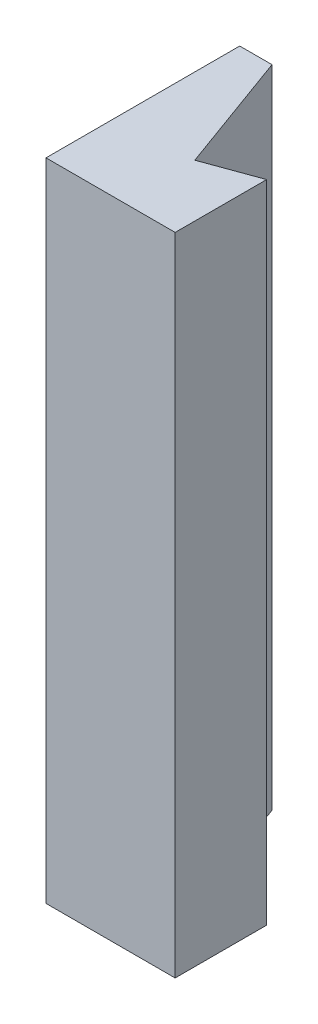
ISO-10303-21;
HEADER;
FILE_DESCRIPTION(('STEP AP214'),'2;1');
FILE_NAME('part.step','',(''),(''),'','','');
FILE_SCHEMA(('AUTOMOTIVE_DESIGN { 1 0 10303 214 1 1 1 1 }'));
ENDSEC;
DATA;
#1=APPLICATION_CONTEXT('core data for automotive mechanical design processes');
#2=APPLICATION_PROTOCOL_DEFINITION('international standard','automotive_design',2000,#1);
#3=PRODUCT_CONTEXT('',#1,'mechanical');
#4=PRODUCT('Part','Part','',(#3));
#5=PRODUCT_RELATED_PRODUCT_CATEGORY('part','',(#4));
#6=PRODUCT_DEFINITION_FORMATION('','',#4);
#7=PRODUCT_DEFINITION_CONTEXT('part definition',#1,'design');
#8=PRODUCT_DEFINITION('design','',#6,#7);
#9=PRODUCT_DEFINITION_SHAPE('','',#8);
#10=(LENGTH_UNIT() NAMED_UNIT(*) SI_UNIT(.MILLI.,.METRE.));
#11=(NAMED_UNIT(*) PLANE_ANGLE_UNIT() SI_UNIT($,.RADIAN.));
#12=(NAMED_UNIT(*) SI_UNIT($,.STERADIAN.) SOLID_ANGLE_UNIT());
#13=UNCERTAINTY_MEASURE_WITH_UNIT(LENGTH_MEASURE(1.E-05),#10,'distance_accuracy_value','');
#14=(GEOMETRIC_REPRESENTATION_CONTEXT(3) GLOBAL_UNCERTAINTY_ASSIGNED_CONTEXT((#13)) GLOBAL_UNIT_ASSIGNED_CONTEXT((#10,
#11,#12)) REPRESENTATION_CONTEXT('',''));
#15=CARTESIAN_POINT('',(0.,0.,0.));
#16=DIRECTION('',(0.,0.,1.));
#17=DIRECTION('',(1.,0.,0.));
#18=AXIS2_PLACEMENT_3D('',#15,#16,#17);
#19=CARTESIAN_POINT('',(-12.7,127.,19.05));
#20=DIRECTION('',(1.,0.,0.));
#21=DIRECTION('',(0.,0.,-1.));
#22=AXIS2_PLACEMENT_3D('',#19,#20,#21);
#23=PLANE('',#22);
#24=DIRECTION('',(0.,0.,1.));
#25=VECTOR('',#24,1.);
#26=CARTESIAN_POINT('',(-12.7,0.,19.05));
#27=LINE('',#26,#25);
#28=CARTESIAN_POINT('',(-12.7,0.,-19.05));
#29=VERTEX_POINT('',#28);
#30=CARTESIAN_POINT('',(-12.7,0.,19.05));
#31=VERTEX_POINT('',#30);
#32=EDGE_CURVE('E116',#29,#31,#27,.T.);
#33=ORIENTED_EDGE('',*,*,#32,.T.);
#34=DIRECTION('',(0.,-1.,0.));
#35=VECTOR('',#34,1.);
#36=CARTESIAN_POINT('',(-12.7,127.,19.05));
#37=LINE('',#36,#35);
#38=CARTESIAN_POINT('',(-12.7,127.,19.05));
#39=VERTEX_POINT('',#38);
#40=EDGE_CURVE('E11',#39,#31,#37,.T.);
#41=ORIENTED_EDGE('',*,*,#40,.F.);
#42=DIRECTION('',(0.,0.,1.));
#43=VECTOR('',#42,1.);
#44=CARTESIAN_POINT('',(-12.7,127.,19.05));
#45=LINE('',#44,#43);
#46=CARTESIAN_POINT('',(-12.7,127.,-19.05));
#47=VERTEX_POINT('',#46);
#48=EDGE_CURVE('E126',#47,#39,#45,.T.);
#49=ORIENTED_EDGE('',*,*,#48,.F.);
#50=DIRECTION('',(0.,-1.,0.));
#51=VECTOR('',#50,1.);
#52=CARTESIAN_POINT('',(-12.7,127.,-19.05));
#53=LINE('',#52,#51);
#54=EDGE_CURVE('E112',#47,#29,#53,.T.);
#55=ORIENTED_EDGE('',*,*,#54,.T.);
#56=EDGE_LOOP('',(#33,#41,#49,#55));
#57=FACE_BOUND('',#56,.T.);
#58=ADVANCED_FACE('F32',(#57),#23,.F.);
#59=CARTESIAN_POINT('',(12.7,127.,19.05));
#60=DIRECTION('',(0.,0.,-1.));
#61=DIRECTION('',(-1.,0.,0.));
#62=AXIS2_PLACEMENT_3D('',#59,#60,#61);
#63=PLANE('',#62);
#64=DIRECTION('',(1.,0.,0.));
#65=VECTOR('',#64,1.);
#66=CARTESIAN_POINT('',(12.7,0.,19.05));
#67=LINE('',#66,#65);
#68=CARTESIAN_POINT('',(12.7,0.,19.05));
#69=VERTEX_POINT('',#68);
#70=EDGE_CURVE('E119',#31,#69,#67,.T.);
#71=ORIENTED_EDGE('',*,*,#70,.T.);
#72=DIRECTION('',(0.,-1.,0.));
#73=VECTOR('',#72,1.);
#74=CARTESIAN_POINT('',(12.7,127.,19.05));
#75=LINE('',#74,#73);
#76=CARTESIAN_POINT('',(12.7,127.,19.05));
#77=VERTEX_POINT('',#76);
#78=EDGE_CURVE('E40',#77,#69,#75,.T.);
#79=ORIENTED_EDGE('',*,*,#78,.F.);
#80=DIRECTION('',(1.,0.,0.));
#81=VECTOR('',#80,1.);
#82=CARTESIAN_POINT('',(12.7,127.,19.05));
#83=LINE('',#82,#81);
#84=EDGE_CURVE('E85',#39,#77,#83,.T.);
#85=ORIENTED_EDGE('',*,*,#84,.F.);
#86=ORIENTED_EDGE('',*,*,#40,.T.);
#87=EDGE_LOOP('',(#71,#79,#85,#86));
#88=FACE_BOUND('',#87,.T.);
#89=ADVANCED_FACE('F150',(#88),#63,.F.);
#90=CARTESIAN_POINT('',(12.7,127.,19.05));
#91=DIRECTION('',(-1.,0.,0.));
#92=DIRECTION('',(0.,0.,1.));
#93=AXIS2_PLACEMENT_3D('',#90,#91,#92);
#94=PLANE('',#93);
#95=DIRECTION('',(0.,0.,-1.));
#96=VECTOR('',#95,1.);
#97=CARTESIAN_POINT('',(12.7,0.,19.05));
#98=LINE('',#97,#96);
#99=CARTESIAN_POINT('',(12.7,0.,1.04648245811693));
#100=VERTEX_POINT('',#99);
#101=EDGE_CURVE('E121',#69,#100,#98,.T.);
#102=ORIENTED_EDGE('',*,*,#101,.T.);
#103=DIRECTION('',(0.,-1.,0.));
#104=VECTOR('',#103,1.);
#105=CARTESIAN_POINT('',(12.7,127.,1.04648245811693));
#106=LINE('',#105,#104);
#107=CARTESIAN_POINT('',(12.7,127.,1.04648245811693));
#108=VERTEX_POINT('',#107);
#109=EDGE_CURVE('E107',#108,#100,#106,.T.);
#110=ORIENTED_EDGE('',*,*,#109,.F.);
#111=DIRECTION('',(0.,0.,-1.));
#112=VECTOR('',#111,1.);
#113=CARTESIAN_POINT('',(12.7,127.,19.05));
#114=LINE('',#113,#112);
#115=EDGE_CURVE('E98',#77,#108,#114,.T.);
#116=ORIENTED_EDGE('',*,*,#115,.F.);
#117=ORIENTED_EDGE('',*,*,#78,.T.);
#118=EDGE_LOOP('',(#102,#110,#116,#117));
#119=FACE_BOUND('',#118,.T.);
#120=ADVANCED_FACE('F132',(#119),#94,.F.);
#121=CARTESIAN_POINT('',(2.3373116404721,127.,4.81819256796204));
#122=DIRECTION('',(0.342020143325676,0.,0.939692620785906));
#123=DIRECTION('',(0.939692620785906,0.,-0.342020143325676));
#124=AXIS2_PLACEMENT_3D('',#121,#122,#123);
#125=PLANE('',#124);
#126=DIRECTION('',(-0.939692620785906,0.,0.342020143325676));
#127=VECTOR('',#126,1.);
#128=CARTESIAN_POINT('',(2.3373116404721,0.,4.81819256796204));
#129=LINE('',#128,#127);
#130=CARTESIAN_POINT('',(2.3373116404721,0.,4.81819256796204));
#131=VERTEX_POINT('',#130);
#132=EDGE_CURVE('E106',#100,#131,#129,.T.);
#133=ORIENTED_EDGE('',*,*,#132,.T.);
#134=DIRECTION('',(0.,-1.,0.));
#135=VECTOR('',#134,1.);
#136=CARTESIAN_POINT('',(2.3373116404721,127.,4.81819256796204));
#137=LINE('',#136,#135);
#138=CARTESIAN_POINT('',(2.3373116404721,127.,4.81819256796204));
#139=VERTEX_POINT('',#138);
#140=EDGE_CURVE('E103',#139,#131,#137,.T.);
#141=ORIENTED_EDGE('',*,*,#140,.F.);
#142=DIRECTION('',(-0.939692620785906,0.,0.342020143325676));
#143=VECTOR('',#142,1.);
#144=CARTESIAN_POINT('',(2.3373116404721,127.,4.81819256796204));
#145=LINE('',#144,#143);
#146=EDGE_CURVE('E92',#108,#139,#145,.T.);
#147=ORIENTED_EDGE('',*,*,#146,.F.);
#148=ORIENTED_EDGE('',*,*,#109,.T.);
#149=EDGE_LOOP('',(#133,#141,#147,#148));
#150=FACE_BOUND('',#149,.T.);
#151=ADVANCED_FACE('F104',(#150),#125,.F.);
#152=CARTESIAN_POINT('',(-6.34999999999999,127.,-19.05));
#153=DIRECTION('',(-0.939692620785907,0.,0.342020143325673));
#154=DIRECTION('',(0.342020143325673,0.,0.939692620785907));
#155=AXIS2_PLACEMENT_3D('',#152,#153,#154);
#156=PLANE('',#155);
#157=DIRECTION('',(-0.342020143325673,0.,-0.939692620785907));
#158=VECTOR('',#157,1.);
#159=CARTESIAN_POINT('',(-6.34999999999999,0.,-19.05));
#160=LINE('',#159,#158);
#161=CARTESIAN_POINT('',(-6.34999999999999,0.,-19.05));
#162=VERTEX_POINT('',#161);
#163=EDGE_CURVE('E71',#131,#162,#160,.T.);
#164=ORIENTED_EDGE('',*,*,#163,.T.);
#165=DIRECTION('',(0.,-1.,0.));
#166=VECTOR('',#165,1.);
#167=CARTESIAN_POINT('',(-6.34999999999999,127.,-19.05));
#168=LINE('',#167,#166);
#169=CARTESIAN_POINT('',(-6.34999999999999,127.,-19.05));
#170=VERTEX_POINT('',#169);
#171=EDGE_CURVE('E108',#170,#162,#168,.T.);
#172=ORIENTED_EDGE('',*,*,#171,.F.);
#173=DIRECTION('',(-0.342020143325673,0.,-0.939692620785907));
#174=VECTOR('',#173,1.);
#175=CARTESIAN_POINT('',(-6.34999999999999,127.,-19.05));
#176=LINE('',#175,#174);
#177=EDGE_CURVE('E96',#139,#170,#176,.T.);
#178=ORIENTED_EDGE('',*,*,#177,.F.);
#179=ORIENTED_EDGE('',*,*,#140,.T.);
#180=EDGE_LOOP('',(#164,#172,#178,#179));
#181=FACE_BOUND('',#180,.T.);
#182=ADVANCED_FACE('F110',(#181),#156,.F.);
#183=CARTESIAN_POINT('',(-6.34999999999999,127.,-19.05));
#184=DIRECTION('',(0.,0.,1.));
#185=DIRECTION('',(1.,0.,0.));
#186=AXIS2_PLACEMENT_3D('',#183,#184,#185);
#187=PLANE('',#186);
#188=DIRECTION('',(-1.,0.,0.));
#189=VECTOR('',#188,1.);
#190=CARTESIAN_POINT('',(-6.34999999999999,0.,-19.05));
#191=LINE('',#190,#189);
#192=EDGE_CURVE('E77',#162,#29,#191,.T.);
#193=ORIENTED_EDGE('',*,*,#192,.T.);
#194=ORIENTED_EDGE('',*,*,#54,.F.);
#195=DIRECTION('',(-1.,0.,0.));
#196=VECTOR('',#195,1.);
#197=CARTESIAN_POINT('',(-6.34999999999999,127.,-19.05));
#198=LINE('',#197,#196);
#199=EDGE_CURVE('E48',#170,#47,#198,.T.);
#200=ORIENTED_EDGE('',*,*,#199,.F.);
#201=ORIENTED_EDGE('',*,*,#171,.T.);
#202=EDGE_LOOP('',(#193,#194,#200,#201));
#203=FACE_BOUND('',#202,.T.);
#204=ADVANCED_FACE('F139',(#203),#187,.F.);
#205=CARTESIAN_POINT('',(0.,127.,0.));
#206=DIRECTION('',(0.,1.,0.));
#207=DIRECTION('',(0.,0.,1.));
#208=AXIS2_PLACEMENT_3D('',#205,#206,#207);
#209=PLANE('',#208);
#210=ORIENTED_EDGE('',*,*,#48,.T.);
#211=ORIENTED_EDGE('',*,*,#84,.T.);
#212=ORIENTED_EDGE('',*,*,#115,.T.);
#213=ORIENTED_EDGE('',*,*,#146,.T.);
#214=ORIENTED_EDGE('',*,*,#177,.T.);
#215=ORIENTED_EDGE('',*,*,#199,.T.);
#216=EDGE_LOOP('',(#210,#211,#212,#213,#214,#215));
#217=FACE_BOUND('',#216,.T.);
#218=ADVANCED_FACE('F94',(#217),#209,.T.);
#219=CARTESIAN_POINT('',(0.,0.,0.));
#220=DIRECTION('',(0.,1.,0.));
#221=DIRECTION('',(0.,0.,1.));
#222=AXIS2_PLACEMENT_3D('',#219,#220,#221);
#223=PLANE('',#222);
#224=ORIENTED_EDGE('',*,*,#32,.F.);
#225=ORIENTED_EDGE('',*,*,#192,.F.);
#226=ORIENTED_EDGE('',*,*,#163,.F.);
#227=ORIENTED_EDGE('',*,*,#132,.F.);
#228=ORIENTED_EDGE('',*,*,#101,.F.);
#229=ORIENTED_EDGE('',*,*,#70,.F.);
#230=EDGE_LOOP('',(#224,#225,#226,#227,#228,#229));
#231=FACE_BOUND('',#230,.T.);
#232=ADVANCED_FACE('F135',(#231),#223,.F.);
#233=CLOSED_SHELL('',(#58,#89,#120,#151,#182,#204,#218,#232));
#234=MANIFOLD_SOLID_BREP('B2',#233);
#235=ADVANCED_BREP_SHAPE_REPRESENTATION('',(#18,#234),#14);
#236=SHAPE_DEFINITION_REPRESENTATION(#9,#235);
ENDSEC;
END-ISO-10303-21;
